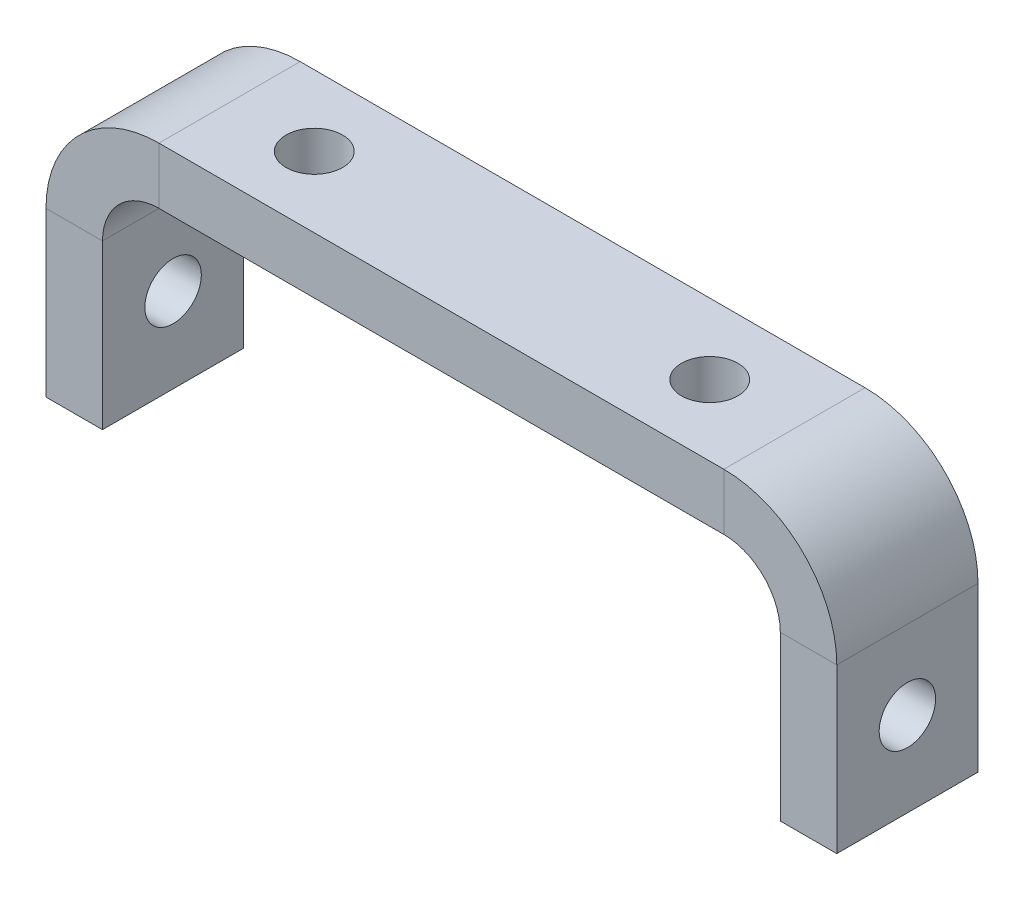
ISO-10303-21;
HEADER;
FILE_DESCRIPTION(('STEP AP214'),'2;1');
FILE_NAME('part.step','',(''),(''),'','','');
FILE_SCHEMA(('AUTOMOTIVE_DESIGN { 1 0 10303 214 1 1 1 1 }'));
ENDSEC;
DATA;
#1=APPLICATION_CONTEXT('core data for automotive mechanical design processes');
#2=APPLICATION_PROTOCOL_DEFINITION('international standard','automotive_design',2000,#1);
#3=PRODUCT_CONTEXT('',#1,'mechanical');
#4=PRODUCT('Part','Part','',(#3));
#5=PRODUCT_RELATED_PRODUCT_CATEGORY('part','',(#4));
#6=PRODUCT_DEFINITION_FORMATION('','',#4);
#7=PRODUCT_DEFINITION_CONTEXT('part definition',#1,'design');
#8=PRODUCT_DEFINITION('design','',#6,#7);
#9=PRODUCT_DEFINITION_SHAPE('','',#8);
#10=(LENGTH_UNIT() NAMED_UNIT(*) SI_UNIT(.MILLI.,.METRE.));
#11=(NAMED_UNIT(*) PLANE_ANGLE_UNIT() SI_UNIT($,.RADIAN.));
#12=(NAMED_UNIT(*) SI_UNIT($,.STERADIAN.) SOLID_ANGLE_UNIT());
#13=UNCERTAINTY_MEASURE_WITH_UNIT(LENGTH_MEASURE(1.E-05),#10,'distance_accuracy_value','');
#14=(GEOMETRIC_REPRESENTATION_CONTEXT(3) GLOBAL_UNCERTAINTY_ASSIGNED_CONTEXT((#13)) GLOBAL_UNIT_ASSIGNED_CONTEXT((#10,
#11,#12)) REPRESENTATION_CONTEXT('',''));
#15=CARTESIAN_POINT('',(0.,0.,0.));
#16=DIRECTION('',(0.,0.,1.));
#17=DIRECTION('',(1.,0.,0.));
#18=AXIS2_PLACEMENT_3D('',#15,#16,#17);
#19=CARTESIAN_POINT('',(0.,0.,0.));
#20=DIRECTION('',(0.,-1.,0.));
#21=DIRECTION('',(0.,0.,-1.));
#22=AXIS2_PLACEMENT_3D('',#19,#20,#21);
#23=PLANE('',#22);
#24=CARTESIAN_POINT('',(14.,0.,0.));
#25=DIRECTION('',(0.,1.,0.));
#26=DIRECTION('',(0.,0.,1.));
#27=AXIS2_PLACEMENT_3D('',#24,#25,#26);
#28=CIRCLE('',#27,2.);
#29=CARTESIAN_POINT('',(14.,0.,2.));
#30=VERTEX_POINT('',#29);
#31=EDGE_CURVE('E239',#30,#30,#28,.T.);
#32=ORIENTED_EDGE('',*,*,#31,.F.);
#33=EDGE_LOOP('',(#32));
#34=FACE_BOUND('',#33,.T.);
#35=CARTESIAN_POINT('',(-14.,0.,0.));
#36=DIRECTION('',(0.,1.,0.));
#37=DIRECTION('',(0.,0.,-1.));
#38=AXIS2_PLACEMENT_3D('',#35,#36,#37);
#39=CIRCLE('',#38,2.);
#40=CARTESIAN_POINT('',(-14.,0.,-2.));
#41=VERTEX_POINT('',#40);
#42=EDGE_CURVE('E231',#41,#41,#39,.T.);
#43=ORIENTED_EDGE('',*,*,#42,.F.);
#44=EDGE_LOOP('',(#43));
#45=FACE_BOUND('',#44,.T.);
#46=DIRECTION('',(-1.,0.,0.));
#47=VECTOR('',#46,1.);
#48=CARTESIAN_POINT('',(-41.,0.,-4.99999999999999));
#49=LINE('',#48,#47);
#50=CARTESIAN_POINT('',(20.,0.,-5.00000000000001));
#51=VERTEX_POINT('',#50);
#52=CARTESIAN_POINT('',(-20.,0.,-4.99999999999999));
#53=VERTEX_POINT('',#52);
#54=EDGE_CURVE('E65',#51,#53,#49,.T.);
#55=ORIENTED_EDGE('',*,*,#54,.T.);
#56=DIRECTION('',(0.,0.,1.));
#57=VECTOR('',#56,1.);
#58=CARTESIAN_POINT('',(-20.,0.,0.));
#59=LINE('',#58,#57);
#60=CARTESIAN_POINT('',(-20.,0.,4.99999999999999));
#61=VERTEX_POINT('',#60);
#62=EDGE_CURVE('E57',#53,#61,#59,.T.);
#63=ORIENTED_EDGE('',*,*,#62,.T.);
#64=DIRECTION('',(1.,0.,0.));
#65=VECTOR('',#64,1.);
#66=CARTESIAN_POINT('',(-41.,0.,4.99999999999999));
#67=LINE('',#66,#65);
#68=CARTESIAN_POINT('',(20.,0.,5.));
#69=VERTEX_POINT('',#68);
#70=EDGE_CURVE('E73',#61,#69,#67,.T.);
#71=ORIENTED_EDGE('',*,*,#70,.T.);
#72=DIRECTION('',(0.,0.,1.));
#73=VECTOR('',#72,1.);
#74=CARTESIAN_POINT('',(20.,0.,0.));
#75=LINE('',#74,#73);
#76=EDGE_CURVE('E253',#51,#69,#75,.T.);
#77=ORIENTED_EDGE('',*,*,#76,.F.);
#78=EDGE_LOOP('',(#55,#63,#71,#77));
#79=FACE_BOUND('',#78,.T.);
#80=ADVANCED_FACE('F48',(#34,#45,#79),#23,.F.);
#81=CARTESIAN_POINT('',(0.,-4.,0.));
#82=DIRECTION('',(0.,-1.,0.));
#83=DIRECTION('',(0.,0.,-1.));
#84=AXIS2_PLACEMENT_3D('',#81,#82,#83);
#85=PLANE('',#84);
#86=DIRECTION('',(0.,0.,1.));
#87=VECTOR('',#86,1.);
#88=CARTESIAN_POINT('',(-20.,-4.,0.));
#89=LINE('',#88,#87);
#90=CARTESIAN_POINT('',(-20.,-4.,-4.99999999999999));
#91=VERTEX_POINT('',#90);
#92=CARTESIAN_POINT('',(-20.,-4.,4.99999999999999));
#93=VERTEX_POINT('',#92);
#94=EDGE_CURVE('E257',#91,#93,#89,.T.);
#95=ORIENTED_EDGE('',*,*,#94,.F.);
#96=DIRECTION('',(-1.,0.,0.));
#97=VECTOR('',#96,1.);
#98=CARTESIAN_POINT('',(-41.,-4.,-4.99999999999999));
#99=LINE('',#98,#97);
#100=CARTESIAN_POINT('',(20.,-4.,-5.00000000000001));
#101=VERTEX_POINT('',#100);
#102=EDGE_CURVE('E264',#101,#91,#99,.T.);
#103=ORIENTED_EDGE('',*,*,#102,.F.);
#104=DIRECTION('',(0.,0.,1.));
#105=VECTOR('',#104,1.);
#106=CARTESIAN_POINT('',(20.,-4.,0.));
#107=LINE('',#106,#105);
#108=CARTESIAN_POINT('',(20.,-4.,5.));
#109=VERTEX_POINT('',#108);
#110=EDGE_CURVE('E247',#101,#109,#107,.T.);
#111=ORIENTED_EDGE('',*,*,#110,.T.);
#112=DIRECTION('',(1.,0.,0.));
#113=VECTOR('',#112,1.);
#114=CARTESIAN_POINT('',(-41.,-4.,4.99999999999999));
#115=LINE('',#114,#113);
#116=EDGE_CURVE('E52',#93,#109,#115,.T.);
#117=ORIENTED_EDGE('',*,*,#116,.F.);
#118=EDGE_LOOP('',(#95,#103,#111,#117));
#119=FACE_BOUND('',#118,.T.);
#120=CARTESIAN_POINT('',(14.,-4.,0.));
#121=DIRECTION('',(0.,1.,0.));
#122=DIRECTION('',(0.,0.,1.));
#123=AXIS2_PLACEMENT_3D('',#120,#121,#122);
#124=CIRCLE('',#123,2.);
#125=CARTESIAN_POINT('',(14.,-4.,2.));
#126=VERTEX_POINT('',#125);
#127=EDGE_CURVE('E242',#126,#126,#124,.T.);
#128=ORIENTED_EDGE('',*,*,#127,.T.);
#129=EDGE_LOOP('',(#128));
#130=FACE_BOUND('',#129,.T.);
#131=CARTESIAN_POINT('',(-14.,-4.,0.));
#132=DIRECTION('',(0.,1.,0.));
#133=DIRECTION('',(0.,0.,-1.));
#134=AXIS2_PLACEMENT_3D('',#131,#132,#133);
#135=CIRCLE('',#134,2.);
#136=CARTESIAN_POINT('',(-14.,-4.,-2.));
#137=VERTEX_POINT('',#136);
#138=EDGE_CURVE('E236',#137,#137,#135,.T.);
#139=ORIENTED_EDGE('',*,*,#138,.T.);
#140=EDGE_LOOP('',(#139));
#141=FACE_BOUND('',#140,.T.);
#142=ADVANCED_FACE('F336',(#119,#130,#141),#85,.T.);
#143=CARTESIAN_POINT('',(-41.,-4.,-4.99999999999999));
#144=DIRECTION('',(0.,0.,-1.));
#145=DIRECTION('',(-1.,0.,0.));
#146=AXIS2_PLACEMENT_3D('',#143,#144,#145);
#147=PLANE('',#146);
#148=DIRECTION('',(0.,-1.,0.));
#149=VECTOR('',#148,1.);
#150=CARTESIAN_POINT('',(-20.,-4.,-4.99999999999999));
#151=LINE('',#150,#149);
#152=EDGE_CURVE('E12',#53,#91,#151,.T.);
#153=ORIENTED_EDGE('',*,*,#152,.F.);
#154=ORIENTED_EDGE('',*,*,#54,.F.);
#155=DIRECTION('',(0.,-1.,0.));
#156=VECTOR('',#155,1.);
#157=CARTESIAN_POINT('',(20.,-4.,-5.));
#158=LINE('',#157,#156);
#159=EDGE_CURVE('E250',#51,#101,#158,.T.);
#160=ORIENTED_EDGE('',*,*,#159,.T.);
#161=ORIENTED_EDGE('',*,*,#102,.T.);
#162=EDGE_LOOP('',(#153,#154,#160,#161));
#163=FACE_BOUND('',#162,.T.);
#164=ADVANCED_FACE('F50',(#163),#147,.T.);
#165=CARTESIAN_POINT('',(-41.,-4.,4.99999999999999));
#166=DIRECTION('',(0.,0.,1.));
#167=DIRECTION('',(1.,0.,0.));
#168=AXIS2_PLACEMENT_3D('',#165,#166,#167);
#169=PLANE('',#168);
#170=DIRECTION('',(0.,1.,0.));
#171=VECTOR('',#170,1.);
#172=CARTESIAN_POINT('',(-20.,-4.,4.99999999999999));
#173=LINE('',#172,#171);
#174=EDGE_CURVE('E260',#93,#61,#173,.T.);
#175=ORIENTED_EDGE('',*,*,#174,.F.);
#176=ORIENTED_EDGE('',*,*,#116,.T.);
#177=DIRECTION('',(0.,1.,0.));
#178=VECTOR('',#177,1.);
#179=CARTESIAN_POINT('',(20.,-4.,5.));
#180=LINE('',#179,#178);
#181=EDGE_CURVE('E255',#109,#69,#180,.T.);
#182=ORIENTED_EDGE('',*,*,#181,.T.);
#183=ORIENTED_EDGE('',*,*,#70,.F.);
#184=EDGE_LOOP('',(#175,#176,#182,#183));
#185=FACE_BOUND('',#184,.T.);
#186=ADVANCED_FACE('F268',(#185),#169,.T.);
#187=CARTESIAN_POINT('',(14.,-4.,0.));
#188=DIRECTION('',(0.,1.,0.));
#189=DIRECTION('',(0.,0.,1.));
#190=AXIS2_PLACEMENT_3D('',#187,#188,#189);
#191=CYLINDRICAL_SURFACE('',#190,2.);
#192=ORIENTED_EDGE('',*,*,#127,.F.);
#193=EDGE_LOOP('',(#192));
#194=FACE_BOUND('',#193,.T.);
#195=ORIENTED_EDGE('',*,*,#31,.T.);
#196=EDGE_LOOP('',(#195));
#197=FACE_BOUND('',#196,.T.);
#198=ADVANCED_FACE('F347',(#194,#197),#191,.F.);
#199=CARTESIAN_POINT('',(-14.,-4.,0.));
#200=DIRECTION('',(0.,1.,0.));
#201=DIRECTION('',(0.,0.,1.));
#202=AXIS2_PLACEMENT_3D('',#199,#200,#201);
#203=CYLINDRICAL_SURFACE('',#202,2.);
#204=ORIENTED_EDGE('',*,*,#138,.F.);
#205=EDGE_LOOP('',(#204));
#206=FACE_BOUND('',#205,.T.);
#207=ORIENTED_EDGE('',*,*,#42,.T.);
#208=EDGE_LOOP('',(#207));
#209=FACE_BOUND('',#208,.T.);
#210=ADVANCED_FACE('F351',(#206,#209),#203,.F.);
#211=CARTESIAN_POINT('',(20.,-8.,-4.99999999999999));
#212=DIRECTION('',(0.,0.,1.));
#213=DIRECTION('',(0.,-1.,0.));
#214=AXIS2_PLACEMENT_3D('',#211,#212,#213);
#215=PLANE('',#214);
#216=ORIENTED_EDGE('',*,*,#159,.F.);
#217=CARTESIAN_POINT('',(20.,-8.,-5.00000000000001));
#218=DIRECTION('',(0.,0.,1.));
#219=DIRECTION('',(1.,0.,0.));
#220=AXIS2_PLACEMENT_3D('',#217,#218,#219);
#221=CIRCLE('',#220,8.);
#222=CARTESIAN_POINT('',(28.,-8.00000000000002,-5.));
#223=VERTEX_POINT('',#222);
#224=EDGE_CURVE('E189',#51,#223,#221,.F.);
#225=ORIENTED_EDGE('',*,*,#224,.T.);
#226=DIRECTION('',(-1.,0.,0.));
#227=VECTOR('',#226,1.);
#228=CARTESIAN_POINT('',(24.,-8.00000000000001,-5.));
#229=LINE('',#228,#227);
#230=CARTESIAN_POINT('',(24.,-8.00000000000002,-5.));
#231=VERTEX_POINT('',#230);
#232=EDGE_CURVE('E216',#223,#231,#229,.T.);
#233=ORIENTED_EDGE('',*,*,#232,.T.);
#234=CARTESIAN_POINT('',(20.,-8.,-4.99999999999999));
#235=DIRECTION('',(0.,0.,-1.));
#236=DIRECTION('',(0.,-1.,0.));
#237=AXIS2_PLACEMENT_3D('',#234,#235,#236);
#238=CIRCLE('',#237,4.);
#239=EDGE_CURVE('E224',#101,#231,#238,.T.);
#240=ORIENTED_EDGE('',*,*,#239,.F.);
#241=EDGE_LOOP('',(#216,#225,#233,#240));
#242=FACE_BOUND('',#241,.T.);
#243=ADVANCED_FACE('F289',(#242),#215,.F.);
#244=CARTESIAN_POINT('',(20.,-8.,5.));
#245=DIRECTION('',(0.,0.,-1.));
#246=DIRECTION('',(-1.,0.,0.));
#247=AXIS2_PLACEMENT_3D('',#244,#245,#246);
#248=PLANE('',#247);
#249=DIRECTION('',(1.,0.,0.));
#250=VECTOR('',#249,1.);
#251=CARTESIAN_POINT('',(24.,-8.,5.));
#252=LINE('',#251,#250);
#253=CARTESIAN_POINT('',(24.,-8.00000000000002,5.));
#254=VERTEX_POINT('',#253);
#255=CARTESIAN_POINT('',(28.,-8.00000000000001,5.));
#256=VERTEX_POINT('',#255);
#257=EDGE_CURVE('E219',#254,#256,#252,.T.);
#258=ORIENTED_EDGE('',*,*,#257,.T.);
#259=CARTESIAN_POINT('',(20.,-8.,5.));
#260=DIRECTION('',(0.,0.,1.));
#261=DIRECTION('',(1.,0.,0.));
#262=AXIS2_PLACEMENT_3D('',#259,#260,#261);
#263=CIRCLE('',#262,8.);
#264=EDGE_CURVE('E228',#256,#69,#263,.T.);
#265=ORIENTED_EDGE('',*,*,#264,.T.);
#266=ORIENTED_EDGE('',*,*,#181,.F.);
#267=CARTESIAN_POINT('',(20.,-8.,5.));
#268=DIRECTION('',(0.,0.,1.));
#269=DIRECTION('',(-1.,0.,0.));
#270=AXIS2_PLACEMENT_3D('',#267,#268,#269);
#271=CIRCLE('',#270,4.);
#272=EDGE_CURVE('E227',#254,#109,#271,.T.);
#273=ORIENTED_EDGE('',*,*,#272,.F.);
#274=EDGE_LOOP('',(#258,#265,#266,#273));
#275=FACE_BOUND('',#274,.T.);
#276=ADVANCED_FACE('F271',(#275),#248,.F.);
#277=CARTESIAN_POINT('',(20.,-8.,-14.3117587881366));
#278=DIRECTION('',(0.,0.,1.));
#279=DIRECTION('',(1.,0.,0.));
#280=AXIS2_PLACEMENT_3D('',#277,#278,#279);
#281=CYLINDRICAL_SURFACE('',#280,4.);
#282=ORIENTED_EDGE('',*,*,#272,.T.);
#283=ORIENTED_EDGE('',*,*,#110,.F.);
#284=ORIENTED_EDGE('',*,*,#239,.T.);
#285=DIRECTION('',(0.,0.,1.));
#286=VECTOR('',#285,1.);
#287=CARTESIAN_POINT('',(24.,-8.00000000000001,0.));
#288=LINE('',#287,#286);
#289=EDGE_CURVE('E181',#231,#254,#288,.T.);
#290=ORIENTED_EDGE('',*,*,#289,.T.);
#291=EDGE_LOOP('',(#282,#283,#284,#290));
#292=FACE_BOUND('',#291,.T.);
#293=ADVANCED_FACE('F275',(#292),#281,.F.);
#294=CARTESIAN_POINT('',(20.,-8.,-14.3117587881366));
#295=DIRECTION('',(0.,0.,1.));
#296=DIRECTION('',(1.,0.,0.));
#297=AXIS2_PLACEMENT_3D('',#294,#295,#296);
#298=CYLINDRICAL_SURFACE('',#297,8.);
#299=ORIENTED_EDGE('',*,*,#264,.F.);
#300=DIRECTION('',(0.,0.,1.));
#301=VECTOR('',#300,1.);
#302=CARTESIAN_POINT('',(28.,-8.00000000000003,0.));
#303=LINE('',#302,#301);
#304=EDGE_CURVE('E197',#223,#256,#303,.T.);
#305=ORIENTED_EDGE('',*,*,#304,.F.);
#306=ORIENTED_EDGE('',*,*,#224,.F.);
#307=ORIENTED_EDGE('',*,*,#76,.T.);
#308=EDGE_LOOP('',(#299,#305,#306,#307));
#309=FACE_BOUND('',#308,.T.);
#310=ADVANCED_FACE('F292',(#309),#298,.T.);
#311=CARTESIAN_POINT('',(24.,-13.5752220392306,0.));
#312=DIRECTION('',(1.,0.,0.));
#313=DIRECTION('',(0.,0.,1.));
#314=AXIS2_PLACEMENT_3D('',#311,#312,#313);
#315=CYLINDRICAL_SURFACE('',#314,2.);
#316=CARTESIAN_POINT('',(24.,-13.5752220392306,0.));
#317=DIRECTION('',(1.,0.,0.));
#318=DIRECTION('',(0.,0.,1.));
#319=AXIS2_PLACEMENT_3D('',#316,#317,#318);
#320=CIRCLE('',#319,2.);
#321=CARTESIAN_POINT('',(24.,-13.5752220392306,2.00000000000001));
#322=VERTEX_POINT('',#321);
#323=EDGE_CURVE('E205',#322,#322,#320,.T.);
#324=ORIENTED_EDGE('',*,*,#323,.F.);
#325=EDGE_LOOP('',(#324));
#326=FACE_BOUND('',#325,.T.);
#327=CARTESIAN_POINT('',(28.,-13.5752220392306,0.));
#328=DIRECTION('',(1.,0.,0.));
#329=DIRECTION('',(0.,0.,1.));
#330=AXIS2_PLACEMENT_3D('',#327,#328,#329);
#331=CIRCLE('',#330,2.);
#332=CARTESIAN_POINT('',(28.,-13.5752220392306,2.00000000000001));
#333=VERTEX_POINT('',#332);
#334=EDGE_CURVE('E213',#333,#333,#331,.T.);
#335=ORIENTED_EDGE('',*,*,#334,.T.);
#336=EDGE_LOOP('',(#335));
#337=FACE_BOUND('',#336,.T.);
#338=ADVANCED_FACE('F362',(#326,#337),#315,.F.);
#339=CARTESIAN_POINT('',(24.,-19.5752220392306,5.00000000000001));
#340=DIRECTION('',(0.,-1.,0.));
#341=DIRECTION('',(0.,0.,-1.));
#342=AXIS2_PLACEMENT_3D('',#339,#340,#341);
#343=PLANE('',#342);
#344=DIRECTION('',(0.,0.,-1.));
#345=VECTOR('',#344,1.);
#346=CARTESIAN_POINT('',(28.,-19.5752220392306,5.));
#347=LINE('',#346,#345);
#348=CARTESIAN_POINT('',(28.,-19.5752220392306,5.));
#349=VERTEX_POINT('',#348);
#350=CARTESIAN_POINT('',(28.,-19.5752220392306,-5.));
#351=VERTEX_POINT('',#350);
#352=EDGE_CURVE('E192',#349,#351,#347,.T.);
#353=ORIENTED_EDGE('',*,*,#352,.F.);
#354=DIRECTION('',(1.,0.,0.));
#355=VECTOR('',#354,1.);
#356=CARTESIAN_POINT('',(24.,-19.5752220392306,5.00000000000001));
#357=LINE('',#356,#355);
#358=CARTESIAN_POINT('',(24.,-19.5752220392306,5.00000000000001));
#359=VERTEX_POINT('',#358);
#360=EDGE_CURVE('E186',#359,#349,#357,.T.);
#361=ORIENTED_EDGE('',*,*,#360,.F.);
#362=DIRECTION('',(0.,0.,-1.));
#363=VECTOR('',#362,1.);
#364=CARTESIAN_POINT('',(24.,-19.5752220392306,5.00000000000001));
#365=LINE('',#364,#363);
#366=CARTESIAN_POINT('',(24.,-19.5752220392306,-4.99999999999999));
#367=VERTEX_POINT('',#366);
#368=EDGE_CURVE('E210',#359,#367,#365,.T.);
#369=ORIENTED_EDGE('',*,*,#368,.T.);
#370=DIRECTION('',(1.,0.,0.));
#371=VECTOR('',#370,1.);
#372=CARTESIAN_POINT('',(24.,-19.5752220392306,-4.99999999999999));
#373=LINE('',#372,#371);
#374=EDGE_CURVE('E208',#367,#351,#373,.T.);
#375=ORIENTED_EDGE('',*,*,#374,.T.);
#376=EDGE_LOOP('',(#353,#361,#369,#375));
#377=FACE_BOUND('',#376,.T.);
#378=ADVANCED_FACE('F377',(#377),#343,.T.);
#379=CARTESIAN_POINT('',(24.0000000000001,21.4247779607694,0.));
#380=DIRECTION('',(-1.,0.,0.));
#381=DIRECTION('',(0.,0.,-1.));
#382=AXIS2_PLACEMENT_3D('',#379,#380,#381);
#383=PLANE('',#382);
#384=ORIENTED_EDGE('',*,*,#289,.F.);
#385=DIRECTION('',(0.,1.,0.));
#386=VECTOR('',#385,1.);
#387=CARTESIAN_POINT('',(24.0000000000003,62.4247779607694,-5.00000000000001));
#388=LINE('',#387,#386);
#389=EDGE_CURVE('E202',#367,#231,#388,.T.);
#390=ORIENTED_EDGE('',*,*,#389,.F.);
#391=ORIENTED_EDGE('',*,*,#368,.F.);
#392=DIRECTION('',(0.,-1.,0.));
#393=VECTOR('',#392,1.);
#394=CARTESIAN_POINT('',(24.0000000000003,62.4247779607694,4.99999999999997));
#395=LINE('',#394,#393);
#396=EDGE_CURVE('E190',#254,#359,#395,.T.);
#397=ORIENTED_EDGE('',*,*,#396,.F.);
#398=EDGE_LOOP('',(#384,#390,#391,#397));
#399=FACE_BOUND('',#398,.T.);
#400=ORIENTED_EDGE('',*,*,#323,.T.);
#401=EDGE_LOOP('',(#400));
#402=FACE_BOUND('',#401,.T.);
#403=ADVANCED_FACE('F280',(#399,#402),#383,.T.);
#404=CARTESIAN_POINT('',(24.0000000000003,62.4247779607694,-5.00000000000001));
#405=DIRECTION('',(0.,0.,-1.));
#406=DIRECTION('',(0.,1.,0.));
#407=AXIS2_PLACEMENT_3D('',#404,#405,#406);
#408=PLANE('',#407);
#409=ORIENTED_EDGE('',*,*,#232,.F.);
#410=DIRECTION('',(0.,1.,0.));
#411=VECTOR('',#410,1.);
#412=CARTESIAN_POINT('',(28.0000000000003,62.4247779607694,-5.00000000000001));
#413=LINE('',#412,#411);
#414=EDGE_CURVE('E200',#351,#223,#413,.T.);
#415=ORIENTED_EDGE('',*,*,#414,.F.);
#416=ORIENTED_EDGE('',*,*,#374,.F.);
#417=ORIENTED_EDGE('',*,*,#389,.T.);
#418=EDGE_LOOP('',(#409,#415,#416,#417));
#419=FACE_BOUND('',#418,.T.);
#420=ADVANCED_FACE('F285',(#419),#408,.T.);
#421=CARTESIAN_POINT('',(28.0000000000001,21.4247779607694,0.));
#422=DIRECTION('',(-1.,0.,0.));
#423=DIRECTION('',(0.,0.,-1.));
#424=AXIS2_PLACEMENT_3D('',#421,#422,#423);
#425=PLANE('',#424);
#426=ORIENTED_EDGE('',*,*,#334,.F.);
#427=EDGE_LOOP('',(#426));
#428=FACE_BOUND('',#427,.T.);
#429=ORIENTED_EDGE('',*,*,#414,.T.);
#430=ORIENTED_EDGE('',*,*,#304,.T.);
#431=DIRECTION('',(0.,-1.,0.));
#432=VECTOR('',#431,1.);
#433=CARTESIAN_POINT('',(28.0000000000003,62.4247779607694,4.99999999999997));
#434=LINE('',#433,#432);
#435=EDGE_CURVE('E195',#256,#349,#434,.T.);
#436=ORIENTED_EDGE('',*,*,#435,.T.);
#437=ORIENTED_EDGE('',*,*,#352,.T.);
#438=EDGE_LOOP('',(#429,#430,#436,#437));
#439=FACE_BOUND('',#438,.T.);
#440=ADVANCED_FACE('F368',(#428,#439),#425,.F.);
#441=CARTESIAN_POINT('',(24.0000000000003,62.4247779607694,4.99999999999997));
#442=DIRECTION('',(0.,0.,1.));
#443=DIRECTION('',(0.,-1.,0.));
#444=AXIS2_PLACEMENT_3D('',#441,#442,#443);
#445=PLANE('',#444);
#446=ORIENTED_EDGE('',*,*,#257,.F.);
#447=ORIENTED_EDGE('',*,*,#396,.T.);
#448=ORIENTED_EDGE('',*,*,#360,.T.);
#449=ORIENTED_EDGE('',*,*,#435,.F.);
#450=EDGE_LOOP('',(#446,#447,#448,#449));
#451=FACE_BOUND('',#450,.T.);
#452=ADVANCED_FACE('F365',(#451),#445,.T.);
#453=CARTESIAN_POINT('',(-20.,-8.,-4.99999999999999));
#454=DIRECTION('',(0.,0.,1.));
#455=DIRECTION('',(1.,0.,0.));
#456=AXIS2_PLACEMENT_3D('',#453,#454,#455);
#457=PLANE('',#456);
#458=DIRECTION('',(1.,0.,0.));
#459=VECTOR('',#458,1.);
#460=CARTESIAN_POINT('',(-24.,-8.00000000000001,-4.99999999999999));
#461=LINE('',#460,#459);
#462=CARTESIAN_POINT('',(-28.,-8.00000000000003,-4.99999999999999));
#463=VERTEX_POINT('',#462);
#464=CARTESIAN_POINT('',(-24.,-8.00000000000001,-4.99999999999999));
#465=VERTEX_POINT('',#464);
#466=EDGE_CURVE('E148',#463,#465,#461,.T.);
#467=ORIENTED_EDGE('',*,*,#466,.F.);
#468=CARTESIAN_POINT('',(-20.,-8.,-4.99999999999999));
#469=DIRECTION('',(0.,0.,-1.));
#470=DIRECTION('',(-1.,0.,0.));
#471=AXIS2_PLACEMENT_3D('',#468,#469,#470);
#472=CIRCLE('',#471,8.);
#473=EDGE_CURVE('E160',#463,#53,#472,.T.);
#474=ORIENTED_EDGE('',*,*,#473,.T.);
#475=ORIENTED_EDGE('',*,*,#152,.T.);
#476=CARTESIAN_POINT('',(-20.,-8.,-4.99999999999999));
#477=DIRECTION('',(0.,0.,-1.));
#478=DIRECTION('',(1.,0.,0.));
#479=AXIS2_PLACEMENT_3D('',#476,#477,#478);
#480=CIRCLE('',#479,4.);
#481=EDGE_CURVE('E174',#465,#91,#480,.T.);
#482=ORIENTED_EDGE('',*,*,#481,.F.);
#483=EDGE_LOOP('',(#467,#474,#475,#482));
#484=FACE_BOUND('',#483,.T.);
#485=ADVANCED_FACE('F301',(#484),#457,.F.);
#486=CARTESIAN_POINT('',(-20.,-8.,4.99999999999999));
#487=DIRECTION('',(0.,0.,-1.));
#488=DIRECTION('',(-1.,0.,0.));
#489=AXIS2_PLACEMENT_3D('',#486,#487,#488);
#490=PLANE('',#489);
#491=CARTESIAN_POINT('',(-20.,-8.,4.99999999999999));
#492=DIRECTION('',(0.,0.,-1.));
#493=DIRECTION('',(-1.,0.,0.));
#494=AXIS2_PLACEMENT_3D('',#491,#492,#493);
#495=CIRCLE('',#494,8.);
#496=CARTESIAN_POINT('',(-28.,-8.00000000000003,4.99999999999999));
#497=VERTEX_POINT('',#496);
#498=EDGE_CURVE('E178',#61,#497,#495,.F.);
#499=ORIENTED_EDGE('',*,*,#498,.T.);
#500=DIRECTION('',(-1.,0.,0.));
#501=VECTOR('',#500,1.);
#502=CARTESIAN_POINT('',(-24.,-8.00000000000001,4.99999999999999));
#503=LINE('',#502,#501);
#504=CARTESIAN_POINT('',(-24.,-8.00000000000001,4.99999999999999));
#505=VERTEX_POINT('',#504);
#506=EDGE_CURVE('E309',#505,#497,#503,.T.);
#507=ORIENTED_EDGE('',*,*,#506,.F.);
#508=CARTESIAN_POINT('',(-20.,-8.,4.99999999999999));
#509=DIRECTION('',(0.,0.,1.));
#510=DIRECTION('',(-1.,0.,0.));
#511=AXIS2_PLACEMENT_3D('',#508,#509,#510);
#512=CIRCLE('',#511,4.);
#513=EDGE_CURVE('E177',#93,#505,#512,.T.);
#514=ORIENTED_EDGE('',*,*,#513,.F.);
#515=ORIENTED_EDGE('',*,*,#174,.T.);
#516=EDGE_LOOP('',(#499,#507,#514,#515));
#517=FACE_BOUND('',#516,.T.);
#518=ADVANCED_FACE('F384',(#517),#490,.F.);
#519=CARTESIAN_POINT('',(-20.,-8.,14.3117587881366));
#520=DIRECTION('',(0.,0.,-1.));
#521=DIRECTION('',(-1.,0.,0.));
#522=AXIS2_PLACEMENT_3D('',#519,#520,#521);
#523=CYLINDRICAL_SURFACE('',#522,4.);
#524=ORIENTED_EDGE('',*,*,#94,.T.);
#525=ORIENTED_EDGE('',*,*,#513,.T.);
#526=DIRECTION('',(0.,0.,1.));
#527=VECTOR('',#526,1.);
#528=CARTESIAN_POINT('',(-24.,-8.00000000000001,0.));
#529=LINE('',#528,#527);
#530=EDGE_CURVE('E313',#465,#505,#529,.T.);
#531=ORIENTED_EDGE('',*,*,#530,.F.);
#532=ORIENTED_EDGE('',*,*,#481,.T.);
#533=EDGE_LOOP('',(#524,#525,#531,#532));
#534=FACE_BOUND('',#533,.T.);
#535=ADVANCED_FACE('F387',(#534),#523,.F.);
#536=CARTESIAN_POINT('',(-20.,-8.,14.3117587881366));
#537=DIRECTION('',(0.,0.,-1.));
#538=DIRECTION('',(-1.,0.,0.));
#539=AXIS2_PLACEMENT_3D('',#536,#537,#538);
#540=CYLINDRICAL_SURFACE('',#539,8.);
#541=ORIENTED_EDGE('',*,*,#62,.F.);
#542=ORIENTED_EDGE('',*,*,#473,.F.);
#543=DIRECTION('',(0.,0.,1.));
#544=VECTOR('',#543,1.);
#545=CARTESIAN_POINT('',(-28.,-8.00000000000003,0.));
#546=LINE('',#545,#544);
#547=EDGE_CURVE('E166',#463,#497,#546,.T.);
#548=ORIENTED_EDGE('',*,*,#547,.T.);
#549=ORIENTED_EDGE('',*,*,#498,.F.);
#550=EDGE_LOOP('',(#541,#542,#548,#549));
#551=FACE_BOUND('',#550,.T.);
#552=ADVANCED_FACE('F300',(#551),#540,.T.);
#553=CARTESIAN_POINT('',(-24.,-19.5752220392306,4.99999999999998));
#554=DIRECTION('',(0.,-1.,0.));
#555=DIRECTION('',(0.,0.,1.));
#556=AXIS2_PLACEMENT_3D('',#553,#554,#555);
#557=PLANE('',#556);
#558=DIRECTION('',(0.,0.,1.));
#559=VECTOR('',#558,1.);
#560=CARTESIAN_POINT('',(-28.,-19.5752220392306,4.99999999999999));
#561=LINE('',#560,#559);
#562=CARTESIAN_POINT('',(-28.,-19.5752220392306,-4.99999999999999));
#563=VERTEX_POINT('',#562);
#564=CARTESIAN_POINT('',(-28.,-19.5752220392306,4.99999999999999));
#565=VERTEX_POINT('',#564);
#566=EDGE_CURVE('E159',#563,#565,#561,.T.);
#567=ORIENTED_EDGE('',*,*,#566,.F.);
#568=DIRECTION('',(-1.,0.,0.));
#569=VECTOR('',#568,1.);
#570=CARTESIAN_POINT('',(-24.,-19.5752220392306,-5.));
#571=LINE('',#570,#569);
#572=CARTESIAN_POINT('',(-24.,-19.5752220392306,-5.));
#573=VERTEX_POINT('',#572);
#574=EDGE_CURVE('E145',#573,#563,#571,.T.);
#575=ORIENTED_EDGE('',*,*,#574,.F.);
#576=DIRECTION('',(0.,0.,1.));
#577=VECTOR('',#576,1.);
#578=CARTESIAN_POINT('',(-24.,-19.5752220392306,4.99999999999998));
#579=LINE('',#578,#577);
#580=CARTESIAN_POINT('',(-24.,-19.5752220392306,4.99999999999998));
#581=VERTEX_POINT('',#580);
#582=EDGE_CURVE('E156',#573,#581,#579,.T.);
#583=ORIENTED_EDGE('',*,*,#582,.T.);
#584=DIRECTION('',(-1.,0.,0.));
#585=VECTOR('',#584,1.);
#586=CARTESIAN_POINT('',(-24.,-19.5752220392306,4.99999999999998));
#587=LINE('',#586,#585);
#588=EDGE_CURVE('E165',#581,#565,#587,.T.);
#589=ORIENTED_EDGE('',*,*,#588,.T.);
#590=EDGE_LOOP('',(#567,#575,#583,#589));
#591=FACE_BOUND('',#590,.T.);
#592=ADVANCED_FACE('F155',(#591),#557,.T.);
#593=CARTESIAN_POINT('',(-24.,-13.5752220392306,0.));
#594=DIRECTION('',(-1.,0.,0.));
#595=DIRECTION('',(0.,0.,1.));
#596=AXIS2_PLACEMENT_3D('',#593,#594,#595);
#597=CYLINDRICAL_SURFACE('',#596,2.);
#598=CARTESIAN_POINT('',(-24.,-13.5752220392306,0.));
#599=DIRECTION('',(-1.,0.,0.));
#600=DIRECTION('',(0.,0.,-1.));
#601=AXIS2_PLACEMENT_3D('',#598,#599,#600);
#602=CIRCLE('',#601,2.);
#603=CARTESIAN_POINT('',(-24.,-13.5752220392306,-2.));
#604=VERTEX_POINT('',#603);
#605=EDGE_CURVE('E315',#604,#604,#602,.T.);
#606=ORIENTED_EDGE('',*,*,#605,.F.);
#607=EDGE_LOOP('',(#606));
#608=FACE_BOUND('',#607,.T.);
#609=CARTESIAN_POINT('',(-28.,-13.5752220392306,0.));
#610=DIRECTION('',(-1.,0.,0.));
#611=DIRECTION('',(0.,0.,-1.));
#612=AXIS2_PLACEMENT_3D('',#609,#610,#611);
#613=CIRCLE('',#612,2.);
#614=CARTESIAN_POINT('',(-28.,-13.5752220392306,-2.));
#615=VERTEX_POINT('',#614);
#616=EDGE_CURVE('E168',#615,#615,#613,.T.);
#617=ORIENTED_EDGE('',*,*,#616,.T.);
#618=EDGE_LOOP('',(#617));
#619=FACE_BOUND('',#618,.T.);
#620=ADVANCED_FACE('F320',(#608,#619),#597,.F.);
#621=CARTESIAN_POINT('',(-24.0000000000001,21.4247779607694,0.));
#622=DIRECTION('',(1.,0.,0.));
#623=DIRECTION('',(0.,0.,-1.));
#624=AXIS2_PLACEMENT_3D('',#621,#622,#623);
#625=PLANE('',#624);
#626=ORIENTED_EDGE('',*,*,#605,.T.);
#627=EDGE_LOOP('',(#626));
#628=FACE_BOUND('',#627,.T.);
#629=DIRECTION('',(0.,-1.,0.));
#630=VECTOR('',#629,1.);
#631=CARTESIAN_POINT('',(-24.,-19.5752220392306,-5.));
#632=LINE('',#631,#630);
#633=EDGE_CURVE('E142',#465,#573,#632,.T.);
#634=ORIENTED_EDGE('',*,*,#633,.F.);
#635=ORIENTED_EDGE('',*,*,#530,.T.);
#636=DIRECTION('',(0.,1.,0.));
#637=VECTOR('',#636,1.);
#638=CARTESIAN_POINT('',(-24.,-19.5752220392306,4.99999999999998));
#639=LINE('',#638,#637);
#640=EDGE_CURVE('E164',#581,#505,#639,.T.);
#641=ORIENTED_EDGE('',*,*,#640,.F.);
#642=ORIENTED_EDGE('',*,*,#582,.F.);
#643=EDGE_LOOP('',(#634,#635,#641,#642));
#644=FACE_BOUND('',#643,.T.);
#645=ADVANCED_FACE('F162',(#628,#644),#625,.T.);
#646=CARTESIAN_POINT('',(-24.,-19.5752220392306,4.99999999999998));
#647=DIRECTION('',(0.,0.,1.));
#648=DIRECTION('',(0.,1.,0.));
#649=AXIS2_PLACEMENT_3D('',#646,#647,#648);
#650=PLANE('',#649);
#651=ORIENTED_EDGE('',*,*,#640,.T.);
#652=ORIENTED_EDGE('',*,*,#506,.T.);
#653=DIRECTION('',(0.,1.,0.));
#654=VECTOR('',#653,1.);
#655=CARTESIAN_POINT('',(-28.,-19.5752220392306,4.99999999999999));
#656=LINE('',#655,#654);
#657=EDGE_CURVE('E302',#565,#497,#656,.T.);
#658=ORIENTED_EDGE('',*,*,#657,.F.);
#659=ORIENTED_EDGE('',*,*,#588,.F.);
#660=EDGE_LOOP('',(#651,#652,#658,#659));
#661=FACE_BOUND('',#660,.T.);
#662=ADVANCED_FACE('F324',(#661),#650,.T.);
#663=CARTESIAN_POINT('',(-28.0000000000001,21.4247779607694,0.));
#664=DIRECTION('',(1.,0.,0.));
#665=DIRECTION('',(0.,0.,-1.));
#666=AXIS2_PLACEMENT_3D('',#663,#664,#665);
#667=PLANE('',#666);
#668=ORIENTED_EDGE('',*,*,#547,.F.);
#669=DIRECTION('',(0.,-1.,0.));
#670=VECTOR('',#669,1.);
#671=CARTESIAN_POINT('',(-28.,-19.5752220392306,-4.99999999999999));
#672=LINE('',#671,#670);
#673=EDGE_CURVE('E307',#463,#563,#672,.T.);
#674=ORIENTED_EDGE('',*,*,#673,.T.);
#675=ORIENTED_EDGE('',*,*,#566,.T.);
#676=ORIENTED_EDGE('',*,*,#657,.T.);
#677=EDGE_LOOP('',(#668,#674,#675,#676));
#678=FACE_BOUND('',#677,.T.);
#679=ORIENTED_EDGE('',*,*,#616,.F.);
#680=EDGE_LOOP('',(#679));
#681=FACE_BOUND('',#680,.T.);
#682=ADVANCED_FACE('F322',(#678,#681),#667,.F.);
#683=CARTESIAN_POINT('',(-24.,-19.5752220392306,-5.));
#684=DIRECTION('',(0.,0.,-1.));
#685=DIRECTION('',(0.,-1.,0.));
#686=AXIS2_PLACEMENT_3D('',#683,#684,#685);
#687=PLANE('',#686);
#688=ORIENTED_EDGE('',*,*,#673,.F.);
#689=ORIENTED_EDGE('',*,*,#466,.T.);
#690=ORIENTED_EDGE('',*,*,#633,.T.);
#691=ORIENTED_EDGE('',*,*,#574,.T.);
#692=EDGE_LOOP('',(#688,#689,#690,#691));
#693=FACE_BOUND('',#692,.T.);
#694=ADVANCED_FACE('F144',(#693),#687,.T.);
#695=CLOSED_SHELL('',(#80,#142,#164,#186,#198,#210,#243,#276,#293,#310,#338,#378,#403,#420,#440,
#452,#485,#518,#535,#552,#592,#620,#645,#662,#682,#694));
#696=MANIFOLD_SOLID_BREP('B2',#695);
#697=ADVANCED_BREP_SHAPE_REPRESENTATION('',(#18,#696),#14);
#698=SHAPE_DEFINITION_REPRESENTATION(#9,#697);
ENDSEC;
END-ISO-10303-21;
